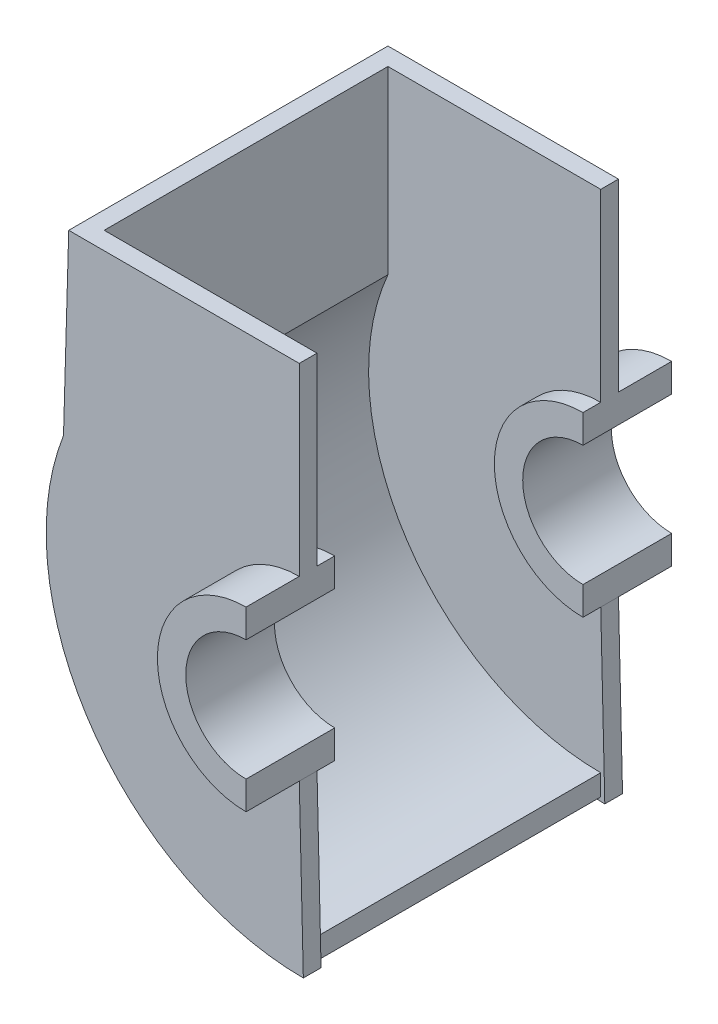
ISO-10303-21;
HEADER;
FILE_DESCRIPTION(('STEP AP214'),'2;1');
FILE_NAME('part.step','',(''),(''),'','','');
FILE_SCHEMA(('AUTOMOTIVE_DESIGN { 1 0 10303 214 1 1 1 1 }'));
ENDSEC;
DATA;
#1=APPLICATION_CONTEXT('core data for automotive mechanical design processes');
#2=APPLICATION_PROTOCOL_DEFINITION('international standard','automotive_design',2000,#1);
#3=PRODUCT_CONTEXT('',#1,'mechanical');
#4=PRODUCT('Part','Part','',(#3));
#5=PRODUCT_RELATED_PRODUCT_CATEGORY('part','',(#4));
#6=PRODUCT_DEFINITION_FORMATION('','',#4);
#7=PRODUCT_DEFINITION_CONTEXT('part definition',#1,'design');
#8=PRODUCT_DEFINITION('design','',#6,#7);
#9=PRODUCT_DEFINITION_SHAPE('','',#8);
#10=(LENGTH_UNIT() NAMED_UNIT(*) SI_UNIT(.MILLI.,.METRE.));
#11=(NAMED_UNIT(*) PLANE_ANGLE_UNIT() SI_UNIT($,.RADIAN.));
#12=(NAMED_UNIT(*) SI_UNIT($,.STERADIAN.) SOLID_ANGLE_UNIT());
#13=UNCERTAINTY_MEASURE_WITH_UNIT(LENGTH_MEASURE(1.E-05),#10,'distance_accuracy_value','');
#14=(GEOMETRIC_REPRESENTATION_CONTEXT(3) GLOBAL_UNCERTAINTY_ASSIGNED_CONTEXT((#13)) GLOBAL_UNIT_ASSIGNED_CONTEXT((#10,
#11,#12)) REPRESENTATION_CONTEXT('',''));
#15=CARTESIAN_POINT('',(0.,0.,0.));
#16=DIRECTION('',(0.,0.,1.));
#17=DIRECTION('',(1.,0.,0.));
#18=AXIS2_PLACEMENT_3D('',#15,#16,#17);
#19=CARTESIAN_POINT('',(0.,0.,0.));
#20=DIRECTION('',(0.,0.,1.));
#21=DIRECTION('',(1.,0.,0.));
#22=AXIS2_PLACEMENT_3D('',#19,#20,#21);
#23=PLANE('',#22);
#24=CARTESIAN_POINT('',(0.,0.,0.));
#25=DIRECTION('',(0.,0.,1.));
#26=DIRECTION('',(1.,0.,0.));
#27=AXIS2_PLACEMENT_3D('',#24,#25,#26);
#28=CIRCLE('',#27,1662.47990401776);
#29=CARTESIAN_POINT('',(-1524.,664.276622547351,0.));
#30=VERTEX_POINT('',#29);
#31=CARTESIAN_POINT('',(0.,-1662.47990401776,0.));
#32=VERTEX_POINT('',#31);
#33=EDGE_CURVE('E52',#30,#32,#28,.T.);
#34=ORIENTED_EDGE('',*,*,#33,.F.);
#35=DIRECTION('',(0.,-1.,0.));
#36=VECTOR('',#35,1.);
#37=CARTESIAN_POINT('',(-1524.,1955.8,0.));
#38=LINE('',#37,#36);
#39=CARTESIAN_POINT('',(-1524.,1955.8,0.));
#40=VERTEX_POINT('',#39);
#41=EDGE_CURVE('E363',#40,#30,#38,.T.);
#42=ORIENTED_EDGE('',*,*,#41,.F.);
#43=DIRECTION('',(-1.,0.,0.));
#44=VECTOR('',#43,1.);
#45=CARTESIAN_POINT('',(-2.63037455065037E-13,1955.8,0.));
#46=LINE('',#45,#44);
#47=CARTESIAN_POINT('',(0.,1955.8,0.));
#48=VERTEX_POINT('',#47);
#49=EDGE_CURVE('E400',#48,#40,#46,.T.);
#50=ORIENTED_EDGE('',*,*,#49,.F.);
#51=DIRECTION('',(0.,1.,0.));
#52=VECTOR('',#51,1.);
#53=CARTESIAN_POINT('',(0.,0.,0.));
#54=LINE('',#53,#52);
#55=CARTESIAN_POINT('',(0.,635.,0.));
#56=VERTEX_POINT('',#55);
#57=EDGE_CURVE('E352',#56,#48,#54,.T.);
#58=ORIENTED_EDGE('',*,*,#57,.F.);
#59=CARTESIAN_POINT('',(0.,0.,0.));
#60=DIRECTION('',(0.,0.,1.));
#61=DIRECTION('',(1.,0.,0.));
#62=AXIS2_PLACEMENT_3D('',#59,#60,#61);
#63=CIRCLE('',#62,635.);
#64=CARTESIAN_POINT('',(0.,-635.,0.));
#65=VERTEX_POINT('',#64);
#66=EDGE_CURVE('E417',#65,#56,#63,.F.);
#67=ORIENTED_EDGE('',*,*,#66,.F.);
#68=DIRECTION('',(0.0241122223874156,-0.999709258100344,0.));
#69=VECTOR('',#68,1.);
#70=CARTESIAN_POINT('',(-15.3068095908368,-0.369188535472219,0.));
#71=LINE('',#70,#69);
#72=CARTESIAN_POINT('',(29.0998568580796,-1841.5,0.));
#73=VERTEX_POINT('',#72);
#74=EDGE_CURVE('E389',#65,#73,#71,.T.);
#75=ORIENTED_EDGE('',*,*,#74,.T.);
#76=CARTESIAN_POINT('',(29.0998568580796,0.,0.));
#77=DIRECTION('',(0.,0.,1.));
#78=DIRECTION('',(1.,0.,0.));
#79=AXIS2_PLACEMENT_3D('',#76,#77,#78);
#80=CIRCLE('',#79,1841.5);
#81=CARTESIAN_POINT('',(-1688.41544692733,664.27662254735,0.));
#82=VERTEX_POINT('',#81);
#83=EDGE_CURVE('E402',#82,#73,#80,.T.);
#84=ORIENTED_EDGE('',*,*,#83,.F.);
#85=DIRECTION('',(-0.999580633171048,0.0289578623065677,0.));
#86=VECTOR('',#85,1.);
#87=CARTESIAN_POINT('',(-1685.87651211907,664.203069577092,0.));
#88=LINE('',#87,#86);
#89=CARTESIAN_POINT('',(-1685.87651211907,664.203069577092,0.));
#90=VERTEX_POINT('',#89);
#91=EDGE_CURVE('E358',#90,#82,#88,.T.);
#92=ORIENTED_EDGE('',*,*,#91,.F.);
#93=DIRECTION('',(0.0289578623065759,0.999580633171048,0.));
#94=VECTOR('',#93,1.);
#95=CARTESIAN_POINT('',(-1685.87651211907,664.203069577092,0.));
#96=LINE('',#95,#94);
#97=CARTESIAN_POINT('',(-1648.53251819024,1953.26,0.));
#98=VERTEX_POINT('',#97);
#99=EDGE_CURVE('E355',#90,#98,#96,.T.);
#100=ORIENTED_EDGE('',*,*,#99,.T.);
#101=DIRECTION('',(1.,0.,0.));
#102=VECTOR('',#101,1.);
#103=CARTESIAN_POINT('',(-1651.,1953.26,0.));
#104=LINE('',#103,#102);
#105=CARTESIAN_POINT('',(-1526.54,1953.26,0.));
#106=VERTEX_POINT('',#105);
#107=EDGE_CURVE('E353',#98,#106,#104,.T.);
#108=ORIENTED_EDGE('',*,*,#107,.T.);
#109=DIRECTION('',(0.,-1.,0.));
#110=VECTOR('',#109,1.);
#111=CARTESIAN_POINT('',(-1526.54,1955.8,0.));
#112=LINE('',#111,#110);
#113=CARTESIAN_POINT('',(-1526.54,664.805918426819,0.));
#114=VERTEX_POINT('',#113);
#115=EDGE_CURVE('E350',#106,#114,#112,.T.);
#116=ORIENTED_EDGE('',*,*,#115,.T.);
#117=CARTESIAN_POINT('',(0.,0.,0.));
#118=DIRECTION('',(0.,0.,1.));
#119=DIRECTION('',(1.,0.,0.));
#120=AXIS2_PLACEMENT_3D('',#117,#118,#119);
#121=CIRCLE('',#120,1665.01990401776);
#122=CARTESIAN_POINT('',(-2.54,-1665.01796662238,0.));
#123=VERTEX_POINT('',#122);
#124=EDGE_CURVE('E345',#114,#123,#121,.T.);
#125=ORIENTED_EDGE('',*,*,#124,.T.);
#126=DIRECTION('',(0.,-1.,0.));
#127=VECTOR('',#126,1.);
#128=CARTESIAN_POINT('',(-2.54,-1662.47990401776,0.));
#129=LINE('',#128,#127);
#130=CARTESIAN_POINT('',(-2.54,-1812.40014314192,0.));
#131=VERTEX_POINT('',#130);
#132=EDGE_CURVE('E357',#123,#131,#129,.T.);
#133=ORIENTED_EDGE('',*,*,#132,.T.);
#134=DIRECTION('',(-1.,0.,0.));
#135=VECTOR('',#134,1.);
#136=CARTESIAN_POINT('',(0.,-1812.40014314192,0.));
#137=LINE('',#136,#135);
#138=CARTESIAN_POINT('',(0.,-1812.40014314192,0.));
#139=VERTEX_POINT('',#138);
#140=EDGE_CURVE('E349',#139,#131,#137,.T.);
#141=ORIENTED_EDGE('',*,*,#140,.F.);
#142=DIRECTION('',(0.,-1.,0.));
#143=VECTOR('',#142,1.);
#144=CARTESIAN_POINT('',(0.,-1662.47990401776,0.));
#145=LINE('',#144,#143);
#146=EDGE_CURVE('E57',#32,#139,#145,.T.);
#147=ORIENTED_EDGE('',*,*,#146,.F.);
#148=EDGE_LOOP('',(#34,#42,#50,#58,#67,#75,#84,#92,#100,#108,#116,#125,#133,#141,#147));
#149=FACE_BOUND('',#148,.T.);
#150=ADVANCED_FACE('F35',(#149),#23,.F.);
#151=CARTESIAN_POINT('',(0.,0.,-127.));
#152=DIRECTION('',(0.,0.,1.));
#153=DIRECTION('',(1.,0.,0.));
#154=AXIS2_PLACEMENT_3D('',#151,#152,#153);
#155=CYLINDRICAL_SURFACE('',#154,635.);
#156=DIRECTION('',(0.,0.,1.));
#157=VECTOR('',#156,1.);
#158=CARTESIAN_POINT('',(0.,-635.,-127.));
#159=LINE('',#158,#157);
#160=CARTESIAN_POINT('',(0.,-635.,-127.));
#161=VERTEX_POINT('',#160);
#162=EDGE_CURVE('E39',#161,#65,#159,.T.);
#163=ORIENTED_EDGE('',*,*,#162,.T.);
#164=ORIENTED_EDGE('',*,*,#66,.T.);
#165=DIRECTION('',(0.,0.,1.));
#166=VECTOR('',#165,1.);
#167=CARTESIAN_POINT('',(0.,635.,-127.));
#168=LINE('',#167,#166);
#169=CARTESIAN_POINT('',(0.,635.,-127.));
#170=VERTEX_POINT('',#169);
#171=EDGE_CURVE('E11',#170,#56,#168,.T.);
#172=ORIENTED_EDGE('',*,*,#171,.F.);
#173=CARTESIAN_POINT('',(0.,0.,-127.));
#174=DIRECTION('',(0.,0.,1.));
#175=DIRECTION('',(1.,0.,0.));
#176=AXIS2_PLACEMENT_3D('',#173,#174,#175);
#177=CIRCLE('',#176,635.);
#178=EDGE_CURVE('E434',#170,#161,#177,.T.);
#179=ORIENTED_EDGE('',*,*,#178,.T.);
#180=EDGE_LOOP('',(#163,#164,#172,#179));
#181=FACE_BOUND('',#180,.T.);
#182=ADVANCED_FACE('F481',(#181),#155,.T.);
#183=CARTESIAN_POINT('',(0.,0.,127.));
#184=DIRECTION('',(0.,0.,1.));
#185=DIRECTION('',(1.,0.,0.));
#186=AXIS2_PLACEMENT_3D('',#183,#184,#185);
#187=CIRCLE('',#186,635.);
#188=CARTESIAN_POINT('',(0.,-635.,127.));
#189=VERTEX_POINT('',#188);
#190=CARTESIAN_POINT('',(0.,635.,127.));
#191=VERTEX_POINT('',#190);
#192=EDGE_CURVE('E419',#189,#191,#187,.F.);
#193=ORIENTED_EDGE('',*,*,#192,.F.);
#194=CARTESIAN_POINT('',(0.,-635.,508.));
#195=VERTEX_POINT('',#194);
#196=EDGE_CURVE('E445',#189,#195,#159,.T.);
#197=ORIENTED_EDGE('',*,*,#196,.T.);
#198=CARTESIAN_POINT('',(0.,0.,508.));
#199=DIRECTION('',(0.,0.,1.));
#200=DIRECTION('',(1.,0.,0.));
#201=AXIS2_PLACEMENT_3D('',#198,#199,#200);
#202=CIRCLE('',#201,635.);
#203=CARTESIAN_POINT('',(0.,635.,508.));
#204=VERTEX_POINT('',#203);
#205=EDGE_CURVE('E422',#204,#195,#202,.T.);
#206=ORIENTED_EDGE('',*,*,#205,.F.);
#207=EDGE_CURVE('E44',#191,#204,#168,.T.);
#208=ORIENTED_EDGE('',*,*,#207,.F.);
#209=EDGE_LOOP('',(#193,#197,#206,#208));
#210=FACE_BOUND('',#209,.T.);
#211=ADVANCED_FACE('F37',(#210),#155,.T.);
#212=CARTESIAN_POINT('',(0.,635.,-127.));
#213=DIRECTION('',(1.,0.,0.));
#214=DIRECTION('',(0.,0.,-1.));
#215=AXIS2_PLACEMENT_3D('',#212,#213,#214);
#216=PLANE('',#215);
#217=ORIENTED_EDGE('',*,*,#171,.T.);
#218=ORIENTED_EDGE('',*,*,#57,.T.);
#219=DIRECTION('',(0.,0.,-1.));
#220=VECTOR('',#219,1.);
#221=CARTESIAN_POINT('',(0.,1955.8,127.));
#222=LINE('',#221,#220);
#223=CARTESIAN_POINT('',(0.,1955.8,127.));
#224=VERTEX_POINT('',#223);
#225=EDGE_CURVE('E414',#224,#48,#222,.T.);
#226=ORIENTED_EDGE('',*,*,#225,.F.);
#227=DIRECTION('',(0.,1.,0.));
#228=VECTOR('',#227,1.);
#229=CARTESIAN_POINT('',(0.,0.,127.));
#230=LINE('',#229,#228);
#231=EDGE_CURVE('E386',#191,#224,#230,.T.);
#232=ORIENTED_EDGE('',*,*,#231,.F.);
#233=ORIENTED_EDGE('',*,*,#207,.T.);
#234=DIRECTION('',(0.,1.,0.));
#235=VECTOR('',#234,1.);
#236=CARTESIAN_POINT('',(0.,635.,508.));
#237=LINE('',#236,#235);
#238=CARTESIAN_POINT('',(0.,431.8,508.));
#239=VERTEX_POINT('',#238);
#240=EDGE_CURVE('E431',#239,#204,#237,.T.);
#241=ORIENTED_EDGE('',*,*,#240,.F.);
#242=DIRECTION('',(0.,0.,1.));
#243=VECTOR('',#242,1.);
#244=CARTESIAN_POINT('',(0.,431.8,-127.));
#245=LINE('',#244,#243);
#246=CARTESIAN_POINT('',(0.,431.8,-127.));
#247=VERTEX_POINT('',#246);
#248=EDGE_CURVE('E447',#247,#239,#245,.T.);
#249=ORIENTED_EDGE('',*,*,#248,.F.);
#250=DIRECTION('',(0.,1.,0.));
#251=VECTOR('',#250,1.);
#252=CARTESIAN_POINT('',(0.,635.,-127.));
#253=LINE('',#252,#251);
#254=EDGE_CURVE('E443',#247,#170,#253,.T.);
#255=ORIENTED_EDGE('',*,*,#254,.T.);
#256=EDGE_LOOP('',(#217,#218,#226,#232,#233,#241,#249,#255));
#257=FACE_BOUND('',#256,.T.);
#258=ADVANCED_FACE('F464',(#257),#216,.T.);
#259=CARTESIAN_POINT('',(0.,0.,-127.));
#260=DIRECTION('',(0.,0.,1.));
#261=DIRECTION('',(1.,0.,0.));
#262=AXIS2_PLACEMENT_3D('',#259,#260,#261);
#263=CYLINDRICAL_SURFACE('',#262,431.8);
#264=ORIENTED_EDGE('',*,*,#248,.T.);
#265=CARTESIAN_POINT('',(0.,0.,508.));
#266=DIRECTION('',(0.,0.,-1.));
#267=DIRECTION('',(1.,0.,0.));
#268=AXIS2_PLACEMENT_3D('',#265,#266,#267);
#269=CIRCLE('',#268,431.8);
#270=CARTESIAN_POINT('',(0.,-431.8,508.));
#271=VERTEX_POINT('',#270);
#272=EDGE_CURVE('E428',#271,#239,#269,.T.);
#273=ORIENTED_EDGE('',*,*,#272,.F.);
#274=DIRECTION('',(0.,0.,1.));
#275=VECTOR('',#274,1.);
#276=CARTESIAN_POINT('',(0.,-431.8,-127.));
#277=LINE('',#276,#275);
#278=CARTESIAN_POINT('',(0.,-431.8,-127.));
#279=VERTEX_POINT('',#278);
#280=EDGE_CURVE('E448',#279,#271,#277,.T.);
#281=ORIENTED_EDGE('',*,*,#280,.F.);
#282=CARTESIAN_POINT('',(0.,0.,-127.));
#283=DIRECTION('',(0.,0.,-1.));
#284=DIRECTION('',(1.,0.,0.));
#285=AXIS2_PLACEMENT_3D('',#282,#283,#284);
#286=CIRCLE('',#285,431.8);
#287=EDGE_CURVE('E440',#279,#247,#286,.T.);
#288=ORIENTED_EDGE('',*,*,#287,.T.);
#289=EDGE_LOOP('',(#264,#273,#281,#288));
#290=FACE_BOUND('',#289,.T.);
#291=ADVANCED_FACE('F603',(#290),#263,.F.);
#292=CARTESIAN_POINT('',(0.,-431.8,-127.));
#293=DIRECTION('',(1.,0.,0.));
#294=DIRECTION('',(0.,0.,-1.));
#295=AXIS2_PLACEMENT_3D('',#292,#293,#294);
#296=PLANE('',#295);
#297=ORIENTED_EDGE('',*,*,#280,.T.);
#298=DIRECTION('',(0.,1.,0.));
#299=VECTOR('',#298,1.);
#300=CARTESIAN_POINT('',(0.,-431.8,508.));
#301=LINE('',#300,#299);
#302=EDGE_CURVE('E425',#195,#271,#301,.T.);
#303=ORIENTED_EDGE('',*,*,#302,.F.);
#304=ORIENTED_EDGE('',*,*,#196,.F.);
#305=DIRECTION('',(0.,0.,-1.));
#306=VECTOR('',#305,1.);
#307=CARTESIAN_POINT('',(0.,-635.,127.));
#308=LINE('',#307,#306);
#309=EDGE_CURVE('E398',#189,#65,#308,.T.);
#310=ORIENTED_EDGE('',*,*,#309,.T.);
#311=ORIENTED_EDGE('',*,*,#162,.F.);
#312=DIRECTION('',(0.,1.,0.));
#313=VECTOR('',#312,1.);
#314=CARTESIAN_POINT('',(0.,-431.8,-127.));
#315=LINE('',#314,#313);
#316=EDGE_CURVE('E437',#161,#279,#315,.T.);
#317=ORIENTED_EDGE('',*,*,#316,.T.);
#318=EDGE_LOOP('',(#297,#303,#304,#310,#311,#317));
#319=FACE_BOUND('',#318,.T.);
#320=ADVANCED_FACE('F458',(#319),#296,.T.);
#321=CARTESIAN_POINT('',(0.,0.,-127.));
#322=DIRECTION('',(0.,0.,1.));
#323=DIRECTION('',(1.,0.,0.));
#324=AXIS2_PLACEMENT_3D('',#321,#322,#323);
#325=PLANE('',#324);
#326=ORIENTED_EDGE('',*,*,#178,.F.);
#327=ORIENTED_EDGE('',*,*,#254,.F.);
#328=ORIENTED_EDGE('',*,*,#287,.F.);
#329=ORIENTED_EDGE('',*,*,#316,.F.);
#330=EDGE_LOOP('',(#326,#327,#328,#329));
#331=FACE_BOUND('',#330,.T.);
#332=ADVANCED_FACE('F479',(#331),#325,.F.);
#333=CARTESIAN_POINT('',(0.,0.,508.));
#334=DIRECTION('',(0.,0.,1.));
#335=DIRECTION('',(1.,0.,0.));
#336=AXIS2_PLACEMENT_3D('',#333,#334,#335);
#337=PLANE('',#336);
#338=ORIENTED_EDGE('',*,*,#205,.T.);
#339=ORIENTED_EDGE('',*,*,#302,.T.);
#340=ORIENTED_EDGE('',*,*,#272,.T.);
#341=ORIENTED_EDGE('',*,*,#240,.T.);
#342=EDGE_LOOP('',(#338,#339,#340,#341));
#343=FACE_BOUND('',#342,.T.);
#344=ADVANCED_FACE('F461',(#343),#337,.T.);
#345=CARTESIAN_POINT('',(-2.63037455065037E-13,1955.8,127.));
#346=DIRECTION('',(0.,-1.,0.));
#347=DIRECTION('',(1.,0.,0.));
#348=AXIS2_PLACEMENT_3D('',#345,#346,#347);
#349=PLANE('',#348);
#350=ORIENTED_EDGE('',*,*,#49,.T.);
#351=DIRECTION('',(0.,0.,-1.));
#352=VECTOR('',#351,1.);
#353=CARTESIAN_POINT('',(-1524.,1955.8,4129.17413536867));
#354=LINE('',#353,#352);
#355=CARTESIAN_POINT('',(-1524.,1955.8,-2032.));
#356=VERTEX_POINT('',#355);
#357=EDGE_CURVE('E362',#40,#356,#354,.T.);
#358=ORIENTED_EDGE('',*,*,#357,.T.);
#359=DIRECTION('',(-1.,0.,0.));
#360=VECTOR('',#359,1.);
#361=CARTESIAN_POINT('',(-2.63037455065037E-13,1955.8,-2032.));
#362=LINE('',#361,#360);
#363=CARTESIAN_POINT('',(0.,1955.8,-2032.));
#364=VERTEX_POINT('',#363);
#365=EDGE_CURVE('E243',#364,#356,#362,.T.);
#366=ORIENTED_EDGE('',*,*,#365,.F.);
#367=DIRECTION('',(0.,0.,1.));
#368=VECTOR('',#367,1.);
#369=CARTESIAN_POINT('',(0.,1955.8,-2159.));
#370=LINE('',#369,#368);
#371=CARTESIAN_POINT('',(0.,1955.8,-2159.));
#372=VERTEX_POINT('',#371);
#373=EDGE_CURVE('E239',#372,#364,#370,.T.);
#374=ORIENTED_EDGE('',*,*,#373,.F.);
#375=DIRECTION('',(-1.,0.,0.));
#376=VECTOR('',#375,1.);
#377=CARTESIAN_POINT('',(-2.63037455065037E-13,1955.8,-2159.));
#378=LINE('',#377,#376);
#379=CARTESIAN_POINT('',(-1651.,1955.8,-2159.));
#380=VERTEX_POINT('',#379);
#381=EDGE_CURVE('E226',#372,#380,#378,.T.);
#382=ORIENTED_EDGE('',*,*,#381,.T.);
#383=DIRECTION('',(0.,0.,-1.));
#384=VECTOR('',#383,1.);
#385=CARTESIAN_POINT('',(-1651.,1955.8,127.));
#386=LINE('',#385,#384);
#387=CARTESIAN_POINT('',(-1651.,1955.8,127.));
#388=VERTEX_POINT('',#387);
#389=EDGE_CURVE('E412',#388,#380,#386,.T.);
#390=ORIENTED_EDGE('',*,*,#389,.F.);
#391=DIRECTION('',(-1.,0.,0.));
#392=VECTOR('',#391,1.);
#393=CARTESIAN_POINT('',(-2.63037455065037E-13,1955.8,127.));
#394=LINE('',#393,#392);
#395=EDGE_CURVE('E388',#224,#388,#394,.T.);
#396=ORIENTED_EDGE('',*,*,#395,.F.);
#397=ORIENTED_EDGE('',*,*,#225,.T.);
#398=EDGE_LOOP('',(#350,#358,#366,#374,#382,#390,#396,#397));
#399=FACE_BOUND('',#398,.T.);
#400=ADVANCED_FACE('F241',(#399),#349,.F.);
#401=CARTESIAN_POINT('',(-1706.22757701852,49.429432303266,127.));
#402=DIRECTION('',(0.999580633171048,-0.0289578623065755,0.));
#403=DIRECTION('',(0.0289578623065755,0.999580633171048,0.));
#404=AXIS2_PLACEMENT_3D('',#401,#402,#403);
#405=PLANE('',#404);
#406=ORIENTED_EDGE('',*,*,#389,.T.);
#407=DIRECTION('',(-0.0289578623065755,-0.999580633171048,0.));
#408=VECTOR('',#407,1.);
#409=CARTESIAN_POINT('',(-1706.22757701852,49.429432303266,-2159.));
#410=LINE('',#409,#408);
#411=CARTESIAN_POINT('',(-1688.41544692733,664.27662254735,-2159.));
#412=VERTEX_POINT('',#411);
#413=EDGE_CURVE('E234',#380,#412,#410,.T.);
#414=ORIENTED_EDGE('',*,*,#413,.T.);
#415=DIRECTION('',(0.,0.,1.));
#416=VECTOR('',#415,1.);
#417=CARTESIAN_POINT('',(-1688.41544692733,664.27662254735,-2159.));
#418=LINE('',#417,#416);
#419=CARTESIAN_POINT('',(-1688.41544692733,664.27662254735,-2032.));
#420=VERTEX_POINT('',#419);
#421=EDGE_CURVE('E247',#412,#420,#418,.T.);
#422=ORIENTED_EDGE('',*,*,#421,.T.);
#423=DIRECTION('',(0.,0.,-1.));
#424=VECTOR('',#423,1.);
#425=CARTESIAN_POINT('',(-1688.41544692733,664.27662254735,4129.17413536867));
#426=LINE('',#425,#424);
#427=EDGE_CURVE('E361',#82,#420,#426,.T.);
#428=ORIENTED_EDGE('',*,*,#427,.F.);
#429=DIRECTION('',(0.,0.,-1.));
#430=VECTOR('',#429,1.);
#431=CARTESIAN_POINT('',(-1688.41544692733,664.27662254735,127.));
#432=LINE('',#431,#430);
#433=CARTESIAN_POINT('',(-1688.41544692733,664.27662254735,127.));
#434=VERTEX_POINT('',#433);
#435=EDGE_CURVE('E410',#434,#82,#432,.T.);
#436=ORIENTED_EDGE('',*,*,#435,.F.);
#437=DIRECTION('',(-0.0289578623065755,-0.999580633171048,0.));
#438=VECTOR('',#437,1.);
#439=CARTESIAN_POINT('',(-1706.22757701852,49.429432303266,127.));
#440=LINE('',#439,#438);
#441=EDGE_CURVE('E391',#388,#434,#440,.T.);
#442=ORIENTED_EDGE('',*,*,#441,.F.);
#443=EDGE_LOOP('',(#406,#414,#422,#428,#436,#442));
#444=FACE_BOUND('',#443,.T.);
#445=ADVANCED_FACE('F525',(#444),#405,.F.);
#446=CARTESIAN_POINT('',(29.0998568580796,0.,127.));
#447=DIRECTION('',(0.,0.,-1.));
#448=DIRECTION('',(-1.,0.,0.));
#449=AXIS2_PLACEMENT_3D('',#446,#447,#448);
#450=CYLINDRICAL_SURFACE('',#449,1841.5);
#451=ORIENTED_EDGE('',*,*,#83,.T.);
#452=DIRECTION('',(0.,0.,-1.));
#453=VECTOR('',#452,1.);
#454=CARTESIAN_POINT('',(29.0998568580796,-1841.5,127.));
#455=LINE('',#454,#453);
#456=CARTESIAN_POINT('',(29.0998568580796,-1841.5,127.));
#457=VERTEX_POINT('',#456);
#458=EDGE_CURVE('E408',#457,#73,#455,.T.);
#459=ORIENTED_EDGE('',*,*,#458,.F.);
#460=CARTESIAN_POINT('',(29.0998568580796,0.,127.));
#461=DIRECTION('',(0.,0.,1.));
#462=DIRECTION('',(1.,0.,0.));
#463=AXIS2_PLACEMENT_3D('',#460,#461,#462);
#464=CIRCLE('',#463,1841.5);
#465=EDGE_CURVE('E393',#434,#457,#464,.T.);
#466=ORIENTED_EDGE('',*,*,#465,.F.);
#467=ORIENTED_EDGE('',*,*,#435,.T.);
#468=EDGE_LOOP('',(#451,#459,#466,#467));
#469=FACE_BOUND('',#468,.T.);
#470=ADVANCED_FACE('F530',(#469),#450,.T.);
#471=CARTESIAN_POINT('',(-15.3068095908368,-0.369188535472219,127.));
#472=DIRECTION('',(0.999709258100344,0.0241122223874156,0.));
#473=DIRECTION('',(-0.0241122223874156,0.999709258100344,0.));
#474=AXIS2_PLACEMENT_3D('',#471,#472,#473);
#475=PLANE('',#474);
#476=ORIENTED_EDGE('',*,*,#74,.F.);
#477=ORIENTED_EDGE('',*,*,#309,.F.);
#478=DIRECTION('',(0.0241122223874156,-0.999709258100344,0.));
#479=VECTOR('',#478,1.);
#480=CARTESIAN_POINT('',(-15.3068095908368,-0.369188535472219,127.));
#481=LINE('',#480,#479);
#482=EDGE_CURVE('E395',#189,#457,#481,.T.);
#483=ORIENTED_EDGE('',*,*,#482,.T.);
#484=ORIENTED_EDGE('',*,*,#458,.T.);
#485=EDGE_LOOP('',(#476,#477,#483,#484));
#486=FACE_BOUND('',#485,.T.);
#487=ADVANCED_FACE('F474',(#486),#475,.T.);
#488=CARTESIAN_POINT('',(0.,0.,127.));
#489=DIRECTION('',(0.,0.,1.));
#490=DIRECTION('',(1.,0.,0.));
#491=AXIS2_PLACEMENT_3D('',#488,#489,#490);
#492=PLANE('',#491);
#493=ORIENTED_EDGE('',*,*,#482,.F.);
#494=ORIENTED_EDGE('',*,*,#192,.T.);
#495=ORIENTED_EDGE('',*,*,#231,.T.);
#496=ORIENTED_EDGE('',*,*,#395,.T.);
#497=ORIENTED_EDGE('',*,*,#441,.T.);
#498=ORIENTED_EDGE('',*,*,#465,.T.);
#499=EDGE_LOOP('',(#493,#494,#495,#496,#497,#498));
#500=FACE_BOUND('',#499,.T.);
#501=ADVANCED_FACE('F469',(#500),#492,.T.);
#502=CARTESIAN_POINT('',(-2.54,-1662.47990401776,4129.17413536867));
#503=DIRECTION('',(1.,0.,0.));
#504=DIRECTION('',(0.,0.,-1.));
#505=AXIS2_PLACEMENT_3D('',#502,#503,#504);
#506=PLANE('',#505);
#507=ORIENTED_EDGE('',*,*,#132,.F.);
#508=DIRECTION('',(0.,0.,-1.));
#509=VECTOR('',#508,1.);
#510=CARTESIAN_POINT('',(-2.54,-1665.01796662238,4129.17413536867));
#511=LINE('',#510,#509);
#512=CARTESIAN_POINT('',(-2.54,-1665.01796662238,-2032.));
#513=VERTEX_POINT('',#512);
#514=EDGE_CURVE('E304',#123,#513,#511,.T.);
#515=ORIENTED_EDGE('',*,*,#514,.T.);
#516=DIRECTION('',(0.,1.,0.));
#517=VECTOR('',#516,1.);
#518=CARTESIAN_POINT('',(-2.54,-1662.47990401776,-2032.));
#519=LINE('',#518,#517);
#520=CARTESIAN_POINT('',(-2.54,-1812.40014314192,-2032.));
#521=VERTEX_POINT('',#520);
#522=EDGE_CURVE('E346',#513,#521,#519,.F.);
#523=ORIENTED_EDGE('',*,*,#522,.T.);
#524=DIRECTION('',(0.,0.,-1.));
#525=VECTOR('',#524,1.);
#526=CARTESIAN_POINT('',(-2.54,-1812.40014314192,4129.17413536867));
#527=LINE('',#526,#525);
#528=EDGE_CURVE('E370',#131,#521,#527,.T.);
#529=ORIENTED_EDGE('',*,*,#528,.F.);
#530=EDGE_LOOP('',(#507,#515,#523,#529));
#531=FACE_BOUND('',#530,.T.);
#532=ADVANCED_FACE('F559',(#531),#506,.F.);
#533=CARTESIAN_POINT('',(0.,-1812.40014314192,4129.17413536867));
#534=DIRECTION('',(0.,-1.,0.));
#535=DIRECTION('',(0.,0.,-1.));
#536=AXIS2_PLACEMENT_3D('',#533,#534,#535);
#537=PLANE('',#536);
#538=DIRECTION('',(0.,0.,-1.));
#539=VECTOR('',#538,1.);
#540=CARTESIAN_POINT('',(0.,-1812.40014314192,4129.17413536867));
#541=LINE('',#540,#539);
#542=CARTESIAN_POINT('',(0.,-1812.40014314192,-2032.));
#543=VERTEX_POINT('',#542);
#544=EDGE_CURVE('E368',#139,#543,#541,.T.);
#545=ORIENTED_EDGE('',*,*,#544,.F.);
#546=ORIENTED_EDGE('',*,*,#140,.T.);
#547=ORIENTED_EDGE('',*,*,#528,.T.);
#548=DIRECTION('',(-1.,0.,0.));
#549=VECTOR('',#548,1.);
#550=CARTESIAN_POINT('',(0.,-1812.40014314192,-2032.));
#551=LINE('',#550,#549);
#552=EDGE_CURVE('E342',#543,#521,#551,.T.);
#553=ORIENTED_EDGE('',*,*,#552,.F.);
#554=EDGE_LOOP('',(#545,#546,#547,#553));
#555=FACE_BOUND('',#554,.T.);
#556=ADVANCED_FACE('F563',(#555),#537,.T.);
#557=CARTESIAN_POINT('',(0.,-1662.47990401776,4129.17413536867));
#558=DIRECTION('',(1.,0.,0.));
#559=DIRECTION('',(0.,0.,-1.));
#560=AXIS2_PLACEMENT_3D('',#557,#558,#559);
#561=PLANE('',#560);
#562=DIRECTION('',(0.,0.,-1.));
#563=VECTOR('',#562,1.);
#564=CARTESIAN_POINT('',(-3.05392603965323E-13,-1662.47990401776,4129.17413536867));
#565=LINE('',#564,#563);
#566=CARTESIAN_POINT('',(-3.05392603965323E-13,-1662.47990401776,-2032.));
#567=VERTEX_POINT('',#566);
#568=EDGE_CURVE('E366',#32,#567,#565,.T.);
#569=ORIENTED_EDGE('',*,*,#568,.F.);
#570=ORIENTED_EDGE('',*,*,#146,.T.);
#571=ORIENTED_EDGE('',*,*,#544,.T.);
#572=DIRECTION('',(0.,-1.,0.));
#573=VECTOR('',#572,1.);
#574=CARTESIAN_POINT('',(0.,-1662.47990401776,-2032.));
#575=LINE('',#574,#573);
#576=EDGE_CURVE('E339',#567,#543,#575,.T.);
#577=ORIENTED_EDGE('',*,*,#576,.F.);
#578=EDGE_LOOP('',(#569,#570,#571,#577));
#579=FACE_BOUND('',#578,.T.);
#580=ADVANCED_FACE('F566',(#579),#561,.T.);
#581=CARTESIAN_POINT('',(0.,0.,4129.17413536867));
#582=DIRECTION('',(0.,0.,-1.));
#583=DIRECTION('',(-1.,0.,0.));
#584=AXIS2_PLACEMENT_3D('',#581,#582,#583);
#585=CYLINDRICAL_SURFACE('',#584,1662.47990401776);
#586=DIRECTION('',(0.,0.,-1.));
#587=VECTOR('',#586,1.);
#588=CARTESIAN_POINT('',(-1524.,664.276622547351,4129.17413536867));
#589=LINE('',#588,#587);
#590=CARTESIAN_POINT('',(-1524.,664.276622547351,-2032.));
#591=VERTEX_POINT('',#590);
#592=EDGE_CURVE('E365',#30,#591,#589,.T.);
#593=ORIENTED_EDGE('',*,*,#592,.F.);
#594=ORIENTED_EDGE('',*,*,#33,.T.);
#595=ORIENTED_EDGE('',*,*,#568,.T.);
#596=CARTESIAN_POINT('',(0.,0.,-2032.));
#597=DIRECTION('',(0.,0.,1.));
#598=DIRECTION('',(1.,0.,0.));
#599=AXIS2_PLACEMENT_3D('',#596,#597,#598);
#600=CIRCLE('',#599,1662.47990401776);
#601=EDGE_CURVE('E336',#591,#567,#600,.T.);
#602=ORIENTED_EDGE('',*,*,#601,.F.);
#603=EDGE_LOOP('',(#593,#594,#595,#602));
#604=FACE_BOUND('',#603,.T.);
#605=ADVANCED_FACE('F569',(#604),#585,.F.);
#606=CARTESIAN_POINT('',(-1524.,1955.8,4129.17413536867));
#607=DIRECTION('',(1.,0.,0.));
#608=DIRECTION('',(0.,1.,0.));
#609=AXIS2_PLACEMENT_3D('',#606,#607,#608);
#610=PLANE('',#609);
#611=ORIENTED_EDGE('',*,*,#357,.F.);
#612=ORIENTED_EDGE('',*,*,#41,.T.);
#613=ORIENTED_EDGE('',*,*,#592,.T.);
#614=DIRECTION('',(0.,-1.,0.));
#615=VECTOR('',#614,1.);
#616=CARTESIAN_POINT('',(-1524.,1955.8,-2032.));
#617=LINE('',#616,#615);
#618=EDGE_CURVE('E333',#356,#591,#617,.T.);
#619=ORIENTED_EDGE('',*,*,#618,.F.);
#620=EDGE_LOOP('',(#611,#612,#613,#619));
#621=FACE_BOUND('',#620,.T.);
#622=ADVANCED_FACE('F488',(#621),#610,.T.);
#623=CARTESIAN_POINT('',(-1685.87651211907,664.203069577092,4129.17413536867));
#624=DIRECTION('',(-0.0289578623065677,-0.999580633171048,0.));
#625=DIRECTION('',(0.999580633171048,-0.0289578623065677,0.));
#626=AXIS2_PLACEMENT_3D('',#623,#624,#625);
#627=PLANE('',#626);
#628=DIRECTION('',(0.,0.,-1.));
#629=VECTOR('',#628,1.);
#630=CARTESIAN_POINT('',(-1685.87651211907,664.203069577092,4129.17413536867));
#631=LINE('',#630,#629);
#632=CARTESIAN_POINT('',(-1685.87651211907,664.203069577092,-2032.));
#633=VERTEX_POINT('',#632);
#634=EDGE_CURVE('E330',#90,#633,#631,.T.);
#635=ORIENTED_EDGE('',*,*,#634,.F.);
#636=ORIENTED_EDGE('',*,*,#91,.T.);
#637=ORIENTED_EDGE('',*,*,#427,.T.);
#638=DIRECTION('',(-0.999580633171048,0.0289578623065677,0.));
#639=VECTOR('',#638,1.);
#640=CARTESIAN_POINT('',(-1685.87651211907,664.203069577092,-2032.));
#641=LINE('',#640,#639);
#642=EDGE_CURVE('E317',#633,#420,#641,.T.);
#643=ORIENTED_EDGE('',*,*,#642,.F.);
#644=EDGE_LOOP('',(#635,#636,#637,#643));
#645=FACE_BOUND('',#644,.T.);
#646=ADVANCED_FACE('F534',(#645),#627,.T.);
#647=CARTESIAN_POINT('',(-1685.87651211907,664.203069577092,4129.17413536867));
#648=DIRECTION('',(-0.999580633171048,0.0289578623065758,0.));
#649=DIRECTION('',(-0.0289578623065759,-0.999580633171048,0.));
#650=AXIS2_PLACEMENT_3D('',#647,#648,#649);
#651=PLANE('',#650);
#652=ORIENTED_EDGE('',*,*,#99,.F.);
#653=ORIENTED_EDGE('',*,*,#634,.T.);
#654=DIRECTION('',(0.0289578623065759,0.999580633171048,0.));
#655=VECTOR('',#654,1.);
#656=CARTESIAN_POINT('',(-1685.87651211907,664.203069577092,-2032.));
#657=LINE('',#656,#655);
#658=CARTESIAN_POINT('',(-1648.53251819024,1953.26,-2032.));
#659=VERTEX_POINT('',#658);
#660=EDGE_CURVE('E327',#633,#659,#657,.T.);
#661=ORIENTED_EDGE('',*,*,#660,.T.);
#662=DIRECTION('',(0.,0.,-1.));
#663=VECTOR('',#662,1.);
#664=CARTESIAN_POINT('',(-1648.53251819024,1953.26,4129.17413536867));
#665=LINE('',#664,#663);
#666=EDGE_CURVE('E326',#98,#659,#665,.T.);
#667=ORIENTED_EDGE('',*,*,#666,.F.);
#668=EDGE_LOOP('',(#652,#653,#661,#667));
#669=FACE_BOUND('',#668,.T.);
#670=ADVANCED_FACE('F538',(#669),#651,.F.);
#671=CARTESIAN_POINT('',(-1651.,1953.26,4129.17413536867));
#672=DIRECTION('',(0.,1.,0.));
#673=DIRECTION('',(0.,0.,1.));
#674=AXIS2_PLACEMENT_3D('',#671,#672,#673);
#675=PLANE('',#674);
#676=ORIENTED_EDGE('',*,*,#107,.F.);
#677=ORIENTED_EDGE('',*,*,#666,.T.);
#678=DIRECTION('',(1.,0.,0.));
#679=VECTOR('',#678,1.);
#680=CARTESIAN_POINT('',(-1651.,1953.26,-2032.));
#681=LINE('',#680,#679);
#682=CARTESIAN_POINT('',(-1526.54,1953.26,-2032.));
#683=VERTEX_POINT('',#682);
#684=EDGE_CURVE('E323',#659,#683,#681,.T.);
#685=ORIENTED_EDGE('',*,*,#684,.T.);
#686=DIRECTION('',(0.,0.,-1.));
#687=VECTOR('',#686,1.);
#688=CARTESIAN_POINT('',(-1526.54,1953.26,4129.17413536867));
#689=LINE('',#688,#687);
#690=EDGE_CURVE('E322',#106,#683,#689,.T.);
#691=ORIENTED_EDGE('',*,*,#690,.F.);
#692=EDGE_LOOP('',(#676,#677,#685,#691));
#693=FACE_BOUND('',#692,.T.);
#694=ADVANCED_FACE('F545',(#693),#675,.F.);
#695=CARTESIAN_POINT('',(-1526.54,1955.8,4129.17413536867));
#696=DIRECTION('',(1.,0.,0.));
#697=DIRECTION('',(0.,1.,0.));
#698=AXIS2_PLACEMENT_3D('',#695,#696,#697);
#699=PLANE('',#698);
#700=ORIENTED_EDGE('',*,*,#115,.F.);
#701=ORIENTED_EDGE('',*,*,#690,.T.);
#702=DIRECTION('',(0.,-1.,0.));
#703=VECTOR('',#702,1.);
#704=CARTESIAN_POINT('',(-1526.54,1955.8,-2032.));
#705=LINE('',#704,#703);
#706=CARTESIAN_POINT('',(-1526.54,664.805918426819,-2032.));
#707=VERTEX_POINT('',#706);
#708=EDGE_CURVE('E319',#683,#707,#705,.T.);
#709=ORIENTED_EDGE('',*,*,#708,.T.);
#710=DIRECTION('',(0.,0.,-1.));
#711=VECTOR('',#710,1.);
#712=CARTESIAN_POINT('',(-1526.54,664.805918426819,4129.17413536867));
#713=LINE('',#712,#711);
#714=EDGE_CURVE('E318',#114,#707,#713,.T.);
#715=ORIENTED_EDGE('',*,*,#714,.F.);
#716=EDGE_LOOP('',(#700,#701,#709,#715));
#717=FACE_BOUND('',#716,.T.);
#718=ADVANCED_FACE('F548',(#717),#699,.F.);
#719=CARTESIAN_POINT('',(0.,0.,4129.17413536867));
#720=DIRECTION('',(0.,0.,-1.));
#721=DIRECTION('',(-1.,0.,0.));
#722=AXIS2_PLACEMENT_3D('',#719,#720,#721);
#723=CYLINDRICAL_SURFACE('',#722,1665.01990401776);
#724=ORIENTED_EDGE('',*,*,#124,.F.);
#725=ORIENTED_EDGE('',*,*,#714,.T.);
#726=CARTESIAN_POINT('',(0.,0.,-2032.));
#727=DIRECTION('',(0.,0.,1.));
#728=DIRECTION('',(1.,0.,0.));
#729=AXIS2_PLACEMENT_3D('',#726,#727,#728);
#730=CIRCLE('',#729,1665.01990401776);
#731=EDGE_CURVE('E314',#707,#513,#730,.T.);
#732=ORIENTED_EDGE('',*,*,#731,.T.);
#733=ORIENTED_EDGE('',*,*,#514,.F.);
#734=EDGE_LOOP('',(#724,#725,#732,#733));
#735=FACE_BOUND('',#734,.T.);
#736=ADVANCED_FACE('F555',(#735),#723,.T.);
#737=CARTESIAN_POINT('',(0.,0.,-2032.));
#738=DIRECTION('',(0.,0.,-1.));
#739=DIRECTION('',(1.,0.,0.));
#740=AXIS2_PLACEMENT_3D('',#737,#738,#739);
#741=PLANE('',#740);
#742=ORIENTED_EDGE('',*,*,#618,.T.);
#743=ORIENTED_EDGE('',*,*,#601,.T.);
#744=ORIENTED_EDGE('',*,*,#576,.T.);
#745=ORIENTED_EDGE('',*,*,#552,.T.);
#746=ORIENTED_EDGE('',*,*,#522,.F.);
#747=ORIENTED_EDGE('',*,*,#731,.F.);
#748=ORIENTED_EDGE('',*,*,#708,.F.);
#749=ORIENTED_EDGE('',*,*,#684,.F.);
#750=ORIENTED_EDGE('',*,*,#660,.F.);
#751=ORIENTED_EDGE('',*,*,#642,.T.);
#752=CARTESIAN_POINT('',(29.0998568580796,0.,-2032.));
#753=DIRECTION('',(0.,0.,1.));
#754=DIRECTION('',(1.,0.,0.));
#755=AXIS2_PLACEMENT_3D('',#752,#753,#754);
#756=CIRCLE('',#755,1841.5);
#757=CARTESIAN_POINT('',(29.0998568580796,-1841.5,-2032.));
#758=VERTEX_POINT('',#757);
#759=EDGE_CURVE('E256',#420,#758,#756,.T.);
#760=ORIENTED_EDGE('',*,*,#759,.T.);
#761=DIRECTION('',(0.0241122223874156,-0.999709258100344,0.));
#762=VECTOR('',#761,1.);
#763=CARTESIAN_POINT('',(-15.3068095908368,-0.369188535472219,-2032.));
#764=LINE('',#763,#762);
#765=CARTESIAN_POINT('',(0.,-635.,-2032.));
#766=VERTEX_POINT('',#765);
#767=EDGE_CURVE('E254',#766,#758,#764,.T.);
#768=ORIENTED_EDGE('',*,*,#767,.F.);
#769=CARTESIAN_POINT('',(0.,0.,-2032.));
#770=DIRECTION('',(0.,0.,1.));
#771=DIRECTION('',(1.,0.,0.));
#772=AXIS2_PLACEMENT_3D('',#769,#770,#771);
#773=CIRCLE('',#772,635.);
#774=CARTESIAN_POINT('',(0.,635.,-2032.));
#775=VERTEX_POINT('',#774);
#776=EDGE_CURVE('E246',#766,#775,#773,.F.);
#777=ORIENTED_EDGE('',*,*,#776,.T.);
#778=DIRECTION('',(0.,1.,0.));
#779=VECTOR('',#778,1.);
#780=CARTESIAN_POINT('',(0.,0.,-2032.));
#781=LINE('',#780,#779);
#782=EDGE_CURVE('E266',#775,#364,#781,.T.);
#783=ORIENTED_EDGE('',*,*,#782,.T.);
#784=ORIENTED_EDGE('',*,*,#365,.T.);
#785=EDGE_LOOP('',(#742,#743,#744,#745,#746,#747,#748,#749,#750,#751,#760,#768,#777,#783,#784));
#786=FACE_BOUND('',#785,.T.);
#787=ADVANCED_FACE('F492',(#786),#741,.F.);
#788=CARTESIAN_POINT('',(0.,0.,-1905.));
#789=DIRECTION('',(0.,0.,-1.));
#790=DIRECTION('',(1.,0.,0.));
#791=AXIS2_PLACEMENT_3D('',#788,#789,#790);
#792=CYLINDRICAL_SURFACE('',#791,635.);
#793=DIRECTION('',(0.,0.,-1.));
#794=VECTOR('',#793,1.);
#795=CARTESIAN_POINT('',(0.,-635.,-1905.));
#796=LINE('',#795,#794);
#797=CARTESIAN_POINT('',(0.,-635.,-1905.));
#798=VERTEX_POINT('',#797);
#799=EDGE_CURVE('E311',#798,#766,#796,.T.);
#800=ORIENTED_EDGE('',*,*,#799,.F.);
#801=CARTESIAN_POINT('',(0.,0.,-1905.));
#802=DIRECTION('',(0.,0.,1.));
#803=DIRECTION('',(1.,0.,0.));
#804=AXIS2_PLACEMENT_3D('',#801,#802,#803);
#805=CIRCLE('',#804,635.);
#806=CARTESIAN_POINT('',(0.,635.,-1905.));
#807=VERTEX_POINT('',#806);
#808=EDGE_CURVE('E291',#807,#798,#805,.T.);
#809=ORIENTED_EDGE('',*,*,#808,.F.);
#810=DIRECTION('',(0.,0.,-1.));
#811=VECTOR('',#810,1.);
#812=CARTESIAN_POINT('',(0.,635.,-1905.));
#813=LINE('',#812,#811);
#814=EDGE_CURVE('E301',#807,#775,#813,.T.);
#815=ORIENTED_EDGE('',*,*,#814,.T.);
#816=ORIENTED_EDGE('',*,*,#776,.F.);
#817=EDGE_LOOP('',(#800,#809,#815,#816));
#818=FACE_BOUND('',#817,.T.);
#819=ADVANCED_FACE('F498',(#818),#792,.T.);
#820=CARTESIAN_POINT('',(0.,0.,-2159.));
#821=DIRECTION('',(0.,0.,1.));
#822=DIRECTION('',(1.,0.,0.));
#823=AXIS2_PLACEMENT_3D('',#820,#821,#822);
#824=CIRCLE('',#823,635.);
#825=CARTESIAN_POINT('',(0.,-635.,-2159.));
#826=VERTEX_POINT('',#825);
#827=CARTESIAN_POINT('',(0.,635.,-2159.));
#828=VERTEX_POINT('',#827);
#829=EDGE_CURVE('E280',#826,#828,#824,.F.);
#830=ORIENTED_EDGE('',*,*,#829,.T.);
#831=CARTESIAN_POINT('',(0.,635.,-2540.));
#832=VERTEX_POINT('',#831);
#833=EDGE_CURVE('E252',#828,#832,#813,.T.);
#834=ORIENTED_EDGE('',*,*,#833,.T.);
#835=CARTESIAN_POINT('',(0.,0.,-2540.));
#836=DIRECTION('',(0.,0.,1.));
#837=DIRECTION('',(1.,0.,0.));
#838=AXIS2_PLACEMENT_3D('',#835,#836,#837);
#839=CIRCLE('',#838,635.);
#840=CARTESIAN_POINT('',(0.,-635.,-2540.));
#841=VERTEX_POINT('',#840);
#842=EDGE_CURVE('E282',#832,#841,#839,.T.);
#843=ORIENTED_EDGE('',*,*,#842,.T.);
#844=EDGE_CURVE('E300',#826,#841,#796,.T.);
#845=ORIENTED_EDGE('',*,*,#844,.F.);
#846=EDGE_LOOP('',(#830,#834,#843,#845));
#847=FACE_BOUND('',#846,.T.);
#848=ADVANCED_FACE('F514',(#847),#792,.T.);
#849=CARTESIAN_POINT('',(0.,635.,-1905.));
#850=DIRECTION('',(1.,0.,0.));
#851=DIRECTION('',(0.,0.,1.));
#852=AXIS2_PLACEMENT_3D('',#849,#850,#851);
#853=PLANE('',#852);
#854=ORIENTED_EDGE('',*,*,#814,.F.);
#855=DIRECTION('',(0.,1.,0.));
#856=VECTOR('',#855,1.);
#857=CARTESIAN_POINT('',(0.,635.,-1905.));
#858=LINE('',#857,#856);
#859=CARTESIAN_POINT('',(0.,431.8,-1905.));
#860=VERTEX_POINT('',#859);
#861=EDGE_CURVE('E298',#860,#807,#858,.T.);
#862=ORIENTED_EDGE('',*,*,#861,.F.);
#863=DIRECTION('',(0.,0.,-1.));
#864=VECTOR('',#863,1.);
#865=CARTESIAN_POINT('',(0.,431.8,-1905.));
#866=LINE('',#865,#864);
#867=CARTESIAN_POINT('',(0.,431.8,-2540.));
#868=VERTEX_POINT('',#867);
#869=EDGE_CURVE('E305',#860,#868,#866,.T.);
#870=ORIENTED_EDGE('',*,*,#869,.T.);
#871=DIRECTION('',(0.,1.,0.));
#872=VECTOR('',#871,1.);
#873=CARTESIAN_POINT('',(0.,635.,-2540.));
#874=LINE('',#873,#872);
#875=EDGE_CURVE('E289',#868,#832,#874,.T.);
#876=ORIENTED_EDGE('',*,*,#875,.T.);
#877=ORIENTED_EDGE('',*,*,#833,.F.);
#878=DIRECTION('',(0.,1.,0.));
#879=VECTOR('',#878,1.);
#880=CARTESIAN_POINT('',(0.,0.,-2159.));
#881=LINE('',#880,#879);
#882=EDGE_CURVE('E231',#828,#372,#881,.T.);
#883=ORIENTED_EDGE('',*,*,#882,.T.);
#884=ORIENTED_EDGE('',*,*,#373,.T.);
#885=ORIENTED_EDGE('',*,*,#782,.F.);
#886=EDGE_LOOP('',(#854,#862,#870,#876,#877,#883,#884,#885));
#887=FACE_BOUND('',#886,.T.);
#888=ADVANCED_FACE('F250',(#887),#853,.T.);
#889=CARTESIAN_POINT('',(0.,0.,-1905.));
#890=DIRECTION('',(0.,0.,-1.));
#891=DIRECTION('',(1.,0.,0.));
#892=AXIS2_PLACEMENT_3D('',#889,#890,#891);
#893=CYLINDRICAL_SURFACE('',#892,431.8);
#894=ORIENTED_EDGE('',*,*,#869,.F.);
#895=CARTESIAN_POINT('',(0.,0.,-1905.));
#896=DIRECTION('',(0.,0.,-1.));
#897=DIRECTION('',(1.,0.,0.));
#898=AXIS2_PLACEMENT_3D('',#895,#896,#897);
#899=CIRCLE('',#898,431.8);
#900=CARTESIAN_POINT('',(0.,-431.8,-1905.));
#901=VERTEX_POINT('',#900);
#902=EDGE_CURVE('E296',#901,#860,#899,.T.);
#903=ORIENTED_EDGE('',*,*,#902,.F.);
#904=DIRECTION('',(0.,0.,-1.));
#905=VECTOR('',#904,1.);
#906=CARTESIAN_POINT('',(0.,-431.8,-1905.));
#907=LINE('',#906,#905);
#908=CARTESIAN_POINT('',(0.,-431.8,-2540.));
#909=VERTEX_POINT('',#908);
#910=EDGE_CURVE('E308',#901,#909,#907,.T.);
#911=ORIENTED_EDGE('',*,*,#910,.T.);
#912=CARTESIAN_POINT('',(0.,0.,-2540.));
#913=DIRECTION('',(0.,0.,-1.));
#914=DIRECTION('',(1.,0.,0.));
#915=AXIS2_PLACEMENT_3D('',#912,#913,#914);
#916=CIRCLE('',#915,431.8);
#917=EDGE_CURVE('E287',#909,#868,#916,.T.);
#918=ORIENTED_EDGE('',*,*,#917,.T.);
#919=EDGE_LOOP('',(#894,#903,#911,#918));
#920=FACE_BOUND('',#919,.T.);
#921=ADVANCED_FACE('F505',(#920),#893,.F.);
#922=CARTESIAN_POINT('',(0.,-431.8,-1905.));
#923=DIRECTION('',(1.,0.,0.));
#924=DIRECTION('',(0.,0.,1.));
#925=AXIS2_PLACEMENT_3D('',#922,#923,#924);
#926=PLANE('',#925);
#927=ORIENTED_EDGE('',*,*,#910,.F.);
#928=DIRECTION('',(0.,1.,0.));
#929=VECTOR('',#928,1.);
#930=CARTESIAN_POINT('',(0.,-431.8,-1905.));
#931=LINE('',#930,#929);
#932=EDGE_CURVE('E294',#798,#901,#931,.T.);
#933=ORIENTED_EDGE('',*,*,#932,.F.);
#934=ORIENTED_EDGE('',*,*,#799,.T.);
#935=DIRECTION('',(0.,0.,1.));
#936=VECTOR('',#935,1.);
#937=CARTESIAN_POINT('',(0.,-635.,-2159.));
#938=LINE('',#937,#936);
#939=EDGE_CURVE('E265',#826,#766,#938,.T.);
#940=ORIENTED_EDGE('',*,*,#939,.F.);
#941=ORIENTED_EDGE('',*,*,#844,.T.);
#942=DIRECTION('',(0.,1.,0.));
#943=VECTOR('',#942,1.);
#944=CARTESIAN_POINT('',(0.,-431.8,-2540.));
#945=LINE('',#944,#943);
#946=EDGE_CURVE('E285',#841,#909,#945,.T.);
#947=ORIENTED_EDGE('',*,*,#946,.T.);
#948=EDGE_LOOP('',(#927,#933,#934,#940,#941,#947));
#949=FACE_BOUND('',#948,.T.);
#950=ADVANCED_FACE('F571',(#949),#926,.T.);
#951=CARTESIAN_POINT('',(0.,0.,-1905.));
#952=DIRECTION('',(0.,0.,-1.));
#953=DIRECTION('',(1.,0.,0.));
#954=AXIS2_PLACEMENT_3D('',#951,#952,#953);
#955=PLANE('',#954);
#956=ORIENTED_EDGE('',*,*,#808,.T.);
#957=ORIENTED_EDGE('',*,*,#932,.T.);
#958=ORIENTED_EDGE('',*,*,#902,.T.);
#959=ORIENTED_EDGE('',*,*,#861,.T.);
#960=EDGE_LOOP('',(#956,#957,#958,#959));
#961=FACE_BOUND('',#960,.T.);
#962=ADVANCED_FACE('F500',(#961),#955,.F.);
#963=CARTESIAN_POINT('',(0.,0.,-2540.));
#964=DIRECTION('',(0.,0.,-1.));
#965=DIRECTION('',(1.,0.,0.));
#966=AXIS2_PLACEMENT_3D('',#963,#964,#965);
#967=PLANE('',#966);
#968=ORIENTED_EDGE('',*,*,#842,.F.);
#969=ORIENTED_EDGE('',*,*,#875,.F.);
#970=ORIENTED_EDGE('',*,*,#917,.F.);
#971=ORIENTED_EDGE('',*,*,#946,.F.);
#972=EDGE_LOOP('',(#968,#969,#970,#971));
#973=FACE_BOUND('',#972,.T.);
#974=ADVANCED_FACE('F510',(#973),#967,.T.);
#975=CARTESIAN_POINT('',(29.0998568580796,0.,-2159.));
#976=DIRECTION('',(0.,0.,1.));
#977=DIRECTION('',(-1.,0.,0.));
#978=AXIS2_PLACEMENT_3D('',#975,#976,#977);
#979=CYLINDRICAL_SURFACE('',#978,1841.5);
#980=ORIENTED_EDGE('',*,*,#759,.F.);
#981=ORIENTED_EDGE('',*,*,#421,.F.);
#982=CARTESIAN_POINT('',(29.0998568580796,0.,-2159.));
#983=DIRECTION('',(0.,0.,1.));
#984=DIRECTION('',(1.,0.,0.));
#985=AXIS2_PLACEMENT_3D('',#982,#983,#984);
#986=CIRCLE('',#985,1841.5);
#987=CARTESIAN_POINT('',(29.0998568580796,-1841.5,-2159.));
#988=VERTEX_POINT('',#987);
#989=EDGE_CURVE('E260',#412,#988,#986,.T.);
#990=ORIENTED_EDGE('',*,*,#989,.T.);
#991=DIRECTION('',(0.,0.,1.));
#992=VECTOR('',#991,1.);
#993=CARTESIAN_POINT('',(29.0998568580796,-1841.5,-2159.));
#994=LINE('',#993,#992);
#995=EDGE_CURVE('E273',#988,#758,#994,.T.);
#996=ORIENTED_EDGE('',*,*,#995,.T.);
#997=EDGE_LOOP('',(#980,#981,#990,#996));
#998=FACE_BOUND('',#997,.T.);
#999=ADVANCED_FACE('F522',(#998),#979,.T.);
#1000=CARTESIAN_POINT('',(-15.3068095908368,-0.369188535472219,-2159.));
#1001=DIRECTION('',(0.999709258100344,0.0241122223874156,0.));
#1002=DIRECTION('',(-0.0241122223874156,0.999709258100344,0.));
#1003=AXIS2_PLACEMENT_3D('',#1000,#1001,#1002);
#1004=PLANE('',#1003);
#1005=ORIENTED_EDGE('',*,*,#767,.T.);
#1006=ORIENTED_EDGE('',*,*,#995,.F.);
#1007=DIRECTION('',(0.0241122223874156,-0.999709258100344,0.));
#1008=VECTOR('',#1007,1.);
#1009=CARTESIAN_POINT('',(-15.3068095908368,-0.369188535472219,-2159.));
#1010=LINE('',#1009,#1008);
#1011=EDGE_CURVE('E263',#826,#988,#1010,.T.);
#1012=ORIENTED_EDGE('',*,*,#1011,.F.);
#1013=ORIENTED_EDGE('',*,*,#939,.T.);
#1014=EDGE_LOOP('',(#1005,#1006,#1012,#1013));
#1015=FACE_BOUND('',#1014,.T.);
#1016=ADVANCED_FACE('F519',(#1015),#1004,.T.);
#1017=CARTESIAN_POINT('',(0.,0.,-2159.));
#1018=DIRECTION('',(0.,0.,-1.));
#1019=DIRECTION('',(1.,0.,0.));
#1020=AXIS2_PLACEMENT_3D('',#1017,#1018,#1019);
#1021=PLANE('',#1020);
#1022=ORIENTED_EDGE('',*,*,#1011,.T.);
#1023=ORIENTED_EDGE('',*,*,#989,.F.);
#1024=ORIENTED_EDGE('',*,*,#413,.F.);
#1025=ORIENTED_EDGE('',*,*,#381,.F.);
#1026=ORIENTED_EDGE('',*,*,#882,.F.);
#1027=ORIENTED_EDGE('',*,*,#829,.F.);
#1028=EDGE_LOOP('',(#1022,#1023,#1024,#1025,#1026,#1027));
#1029=FACE_BOUND('',#1028,.T.);
#1030=ADVANCED_FACE('F228',(#1029),#1021,.T.);
#1031=CLOSED_SHELL('',(#150,#182,#211,#258,#291,#320,#332,#344,#400,#445,#470,#487,#501,#532,
#556,#580,#605,#622,#646,#670,#694,#718,#736,#787,#819,#848,#888,#921,#950,#962,#974,#999,#1016,#1030));
#1032=MANIFOLD_SOLID_BREP('B2',#1031);
#1033=ADVANCED_BREP_SHAPE_REPRESENTATION('',(#18,#1032),#14);
#1034=SHAPE_DEFINITION_REPRESENTATION(#9,#1033);
ENDSEC;
END-ISO-10303-21;
